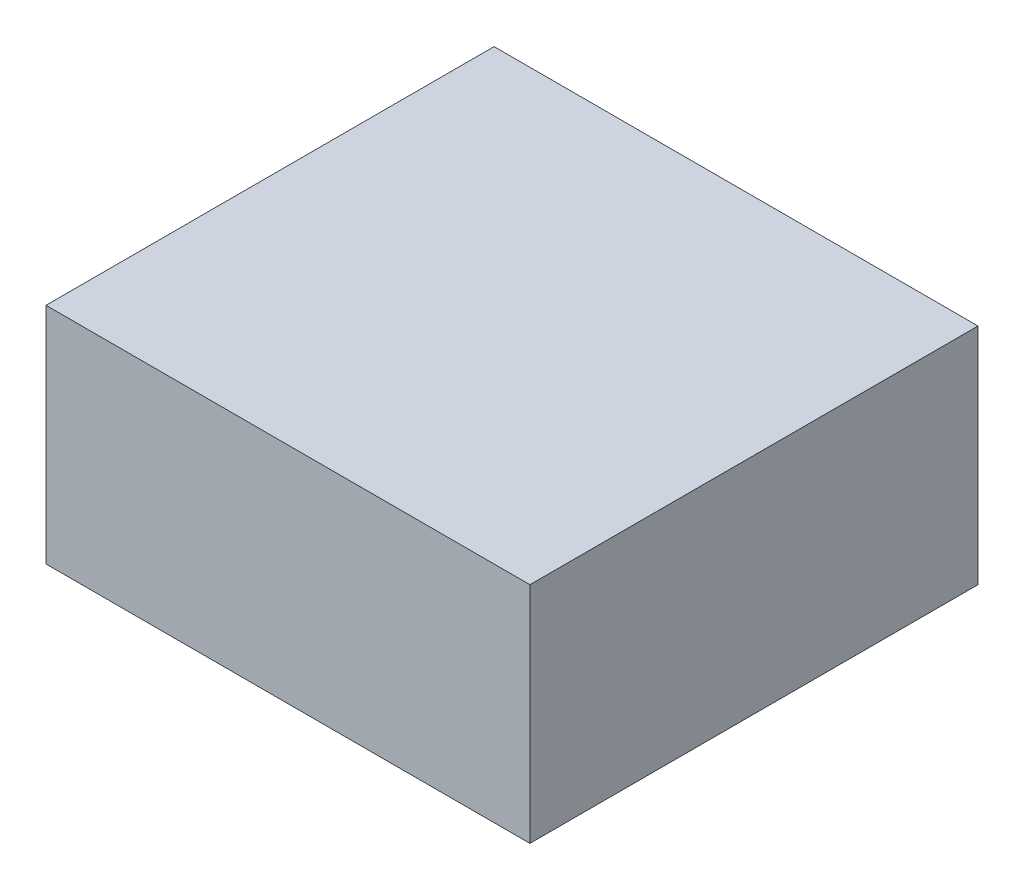
ISO-10303-21;
HEADER;
FILE_DESCRIPTION(('STEP AP214'),'2;1');
FILE_NAME('part.step','',(''),(''),'','','');
FILE_SCHEMA(('AUTOMOTIVE_DESIGN { 1 0 10303 214 1 1 1 1 }'));
ENDSEC;
DATA;
#1=APPLICATION_CONTEXT('core data for automotive mechanical design processes');
#2=APPLICATION_PROTOCOL_DEFINITION('international standard','automotive_design',2000,#1);
#3=PRODUCT_CONTEXT('',#1,'mechanical');
#4=PRODUCT('Part','Part','',(#3));
#5=PRODUCT_RELATED_PRODUCT_CATEGORY('part','',(#4));
#6=PRODUCT_DEFINITION_FORMATION('','',#4);
#7=PRODUCT_DEFINITION_CONTEXT('part definition',#1,'design');
#8=PRODUCT_DEFINITION('design','',#6,#7);
#9=PRODUCT_DEFINITION_SHAPE('','',#8);
#10=(LENGTH_UNIT() NAMED_UNIT(*) SI_UNIT(.MILLI.,.METRE.));
#11=(NAMED_UNIT(*) PLANE_ANGLE_UNIT() SI_UNIT($,.RADIAN.));
#12=(NAMED_UNIT(*) SI_UNIT($,.STERADIAN.) SOLID_ANGLE_UNIT());
#13=UNCERTAINTY_MEASURE_WITH_UNIT(LENGTH_MEASURE(1.E-05),#10,'distance_accuracy_value','');
#14=(GEOMETRIC_REPRESENTATION_CONTEXT(3) GLOBAL_UNCERTAINTY_ASSIGNED_CONTEXT((#13)) GLOBAL_UNIT_ASSIGNED_CONTEXT((#10,
#11,#12)) REPRESENTATION_CONTEXT('',''));
#15=CARTESIAN_POINT('',(0.,0.,0.));
#16=DIRECTION('',(0.,0.,1.));
#17=DIRECTION('',(1.,0.,0.));
#18=AXIS2_PLACEMENT_3D('',#15,#16,#17);
#19=CARTESIAN_POINT('',(80.,150.,-750.));
#20=DIRECTION('',(-1.,0.,0.));
#21=DIRECTION('',(0.,0.,1.));
#22=AXIS2_PLACEMENT_3D('',#19,#20,#21);
#23=PLANE('',#22);
#24=DIRECTION('',(0.,-1.,0.));
#25=VECTOR('',#24,1.);
#26=CARTESIAN_POINT('',(80.,150.,-250.));
#27=LINE('',#26,#25);
#28=CARTESIAN_POINT('',(80.,400.,-250.));
#29=VERTEX_POINT('',#28);
#30=CARTESIAN_POINT('',(80.,150.,-250.));
#31=VERTEX_POINT('',#30);
#32=EDGE_CURVE('E103',#29,#31,#27,.T.);
#33=ORIENTED_EDGE('',*,*,#32,.F.);
#34=DIRECTION('',(0.,0.,1.));
#35=VECTOR('',#34,1.);
#36=CARTESIAN_POINT('',(80.,400.,-750.));
#37=LINE('',#36,#35);
#38=CARTESIAN_POINT('',(80.,400.,-750.));
#39=VERTEX_POINT('',#38);
#40=EDGE_CURVE('E11',#39,#29,#37,.T.);
#41=ORIENTED_EDGE('',*,*,#40,.F.);
#42=DIRECTION('',(0.,-1.,0.));
#43=VECTOR('',#42,1.);
#44=CARTESIAN_POINT('',(80.,150.,-750.));
#45=LINE('',#44,#43);
#46=CARTESIAN_POINT('',(80.,150.,-750.));
#47=VERTEX_POINT('',#46);
#48=EDGE_CURVE('E97',#39,#47,#45,.T.);
#49=ORIENTED_EDGE('',*,*,#48,.T.);
#50=DIRECTION('',(0.,0.,1.));
#51=VECTOR('',#50,1.);
#52=CARTESIAN_POINT('',(80.,150.,-750.));
#53=LINE('',#52,#51);
#54=EDGE_CURVE('E42',#47,#31,#53,.T.);
#55=ORIENTED_EDGE('',*,*,#54,.T.);
#56=EDGE_LOOP('',(#33,#41,#49,#55));
#57=FACE_BOUND('',#56,.T.);
#58=ADVANCED_FACE('F39',(#57),#23,.T.);
#59=CARTESIAN_POINT('',(80.,400.,-750.));
#60=DIRECTION('',(0.,1.,0.));
#61=DIRECTION('',(0.,0.,1.));
#62=AXIS2_PLACEMENT_3D('',#59,#60,#61);
#63=PLANE('',#62);
#64=DIRECTION('',(-1.,0.,0.));
#65=VECTOR('',#64,1.);
#66=CARTESIAN_POINT('',(80.,400.,-250.));
#67=LINE('',#66,#65);
#68=CARTESIAN_POINT('',(620.,400.,-250.));
#69=VERTEX_POINT('',#68);
#70=EDGE_CURVE('E99',#69,#29,#67,.T.);
#71=ORIENTED_EDGE('',*,*,#70,.F.);
#72=DIRECTION('',(0.,0.,1.));
#73=VECTOR('',#72,1.);
#74=CARTESIAN_POINT('',(620.,400.,-750.));
#75=LINE('',#74,#73);
#76=CARTESIAN_POINT('',(620.,400.,-750.));
#77=VERTEX_POINT('',#76);
#78=EDGE_CURVE('E48',#77,#69,#75,.T.);
#79=ORIENTED_EDGE('',*,*,#78,.F.);
#80=DIRECTION('',(-1.,0.,0.));
#81=VECTOR('',#80,1.);
#82=CARTESIAN_POINT('',(80.,400.,-750.));
#83=LINE('',#82,#81);
#84=EDGE_CURVE('E94',#77,#39,#83,.T.);
#85=ORIENTED_EDGE('',*,*,#84,.T.);
#86=ORIENTED_EDGE('',*,*,#40,.T.);
#87=EDGE_LOOP('',(#71,#79,#85,#86));
#88=FACE_BOUND('',#87,.T.);
#89=ADVANCED_FACE('F113',(#88),#63,.T.);
#90=CARTESIAN_POINT('',(620.,150.,-750.));
#91=DIRECTION('',(1.,0.,0.));
#92=DIRECTION('',(0.,0.,-1.));
#93=AXIS2_PLACEMENT_3D('',#90,#91,#92);
#94=PLANE('',#93);
#95=DIRECTION('',(0.,1.,0.));
#96=VECTOR('',#95,1.);
#97=CARTESIAN_POINT('',(620.,150.,-250.));
#98=LINE('',#97,#96);
#99=CARTESIAN_POINT('',(620.,150.,-250.));
#100=VERTEX_POINT('',#99);
#101=EDGE_CURVE('E89',#100,#69,#98,.T.);
#102=ORIENTED_EDGE('',*,*,#101,.F.);
#103=DIRECTION('',(0.,0.,1.));
#104=VECTOR('',#103,1.);
#105=CARTESIAN_POINT('',(620.,150.,-750.));
#106=LINE('',#105,#104);
#107=CARTESIAN_POINT('',(620.,150.,-750.));
#108=VERTEX_POINT('',#107);
#109=EDGE_CURVE('E84',#108,#100,#106,.T.);
#110=ORIENTED_EDGE('',*,*,#109,.F.);
#111=DIRECTION('',(0.,1.,0.));
#112=VECTOR('',#111,1.);
#113=CARTESIAN_POINT('',(620.,150.,-750.));
#114=LINE('',#113,#112);
#115=EDGE_CURVE('E87',#108,#77,#114,.T.);
#116=ORIENTED_EDGE('',*,*,#115,.T.);
#117=ORIENTED_EDGE('',*,*,#78,.T.);
#118=EDGE_LOOP('',(#102,#110,#116,#117));
#119=FACE_BOUND('',#118,.T.);
#120=ADVANCED_FACE('F86',(#119),#94,.T.);
#121=CARTESIAN_POINT('',(80.,150.,-750.));
#122=DIRECTION('',(0.,-1.,0.));
#123=DIRECTION('',(0.,0.,-1.));
#124=AXIS2_PLACEMENT_3D('',#121,#122,#123);
#125=PLANE('',#124);
#126=DIRECTION('',(1.,0.,0.));
#127=VECTOR('',#126,1.);
#128=CARTESIAN_POINT('',(80.,150.,-250.));
#129=LINE('',#128,#127);
#130=EDGE_CURVE('E106',#31,#100,#129,.T.);
#131=ORIENTED_EDGE('',*,*,#130,.F.);
#132=ORIENTED_EDGE('',*,*,#54,.F.);
#133=DIRECTION('',(1.,0.,0.));
#134=VECTOR('',#133,1.);
#135=CARTESIAN_POINT('',(80.,150.,-750.));
#136=LINE('',#135,#134);
#137=EDGE_CURVE('E93',#47,#108,#136,.T.);
#138=ORIENTED_EDGE('',*,*,#137,.T.);
#139=ORIENTED_EDGE('',*,*,#109,.T.);
#140=EDGE_LOOP('',(#131,#132,#138,#139));
#141=FACE_BOUND('',#140,.T.);
#142=ADVANCED_FACE('F96',(#141),#125,.T.);
#143=CARTESIAN_POINT('',(0.,0.,-750.));
#144=DIRECTION('',(0.,0.,-1.));
#145=DIRECTION('',(-1.,0.,0.));
#146=AXIS2_PLACEMENT_3D('',#143,#144,#145);
#147=PLANE('',#146);
#148=ORIENTED_EDGE('',*,*,#48,.F.);
#149=ORIENTED_EDGE('',*,*,#84,.F.);
#150=ORIENTED_EDGE('',*,*,#115,.F.);
#151=ORIENTED_EDGE('',*,*,#137,.F.);
#152=EDGE_LOOP('',(#148,#149,#150,#151));
#153=FACE_BOUND('',#152,.T.);
#154=ADVANCED_FACE('F92',(#153),#147,.T.);
#155=CARTESIAN_POINT('',(0.,0.,-250.));
#156=DIRECTION('',(0.,0.,-1.));
#157=DIRECTION('',(-1.,0.,0.));
#158=AXIS2_PLACEMENT_3D('',#155,#156,#157);
#159=PLANE('',#158);
#160=ORIENTED_EDGE('',*,*,#32,.T.);
#161=ORIENTED_EDGE('',*,*,#130,.T.);
#162=ORIENTED_EDGE('',*,*,#101,.T.);
#163=ORIENTED_EDGE('',*,*,#70,.T.);
#164=EDGE_LOOP('',(#160,#161,#162,#163));
#165=FACE_BOUND('',#164,.T.);
#166=ADVANCED_FACE('F112',(#165),#159,.F.);
#167=CLOSED_SHELL('',(#58,#89,#120,#142,#154,#166));
#168=MANIFOLD_SOLID_BREP('B2',#167);
#169=ADVANCED_BREP_SHAPE_REPRESENTATION('',(#18,#168),#14);
#170=SHAPE_DEFINITION_REPRESENTATION(#9,#169);
ENDSEC;
END-ISO-10303-21;
